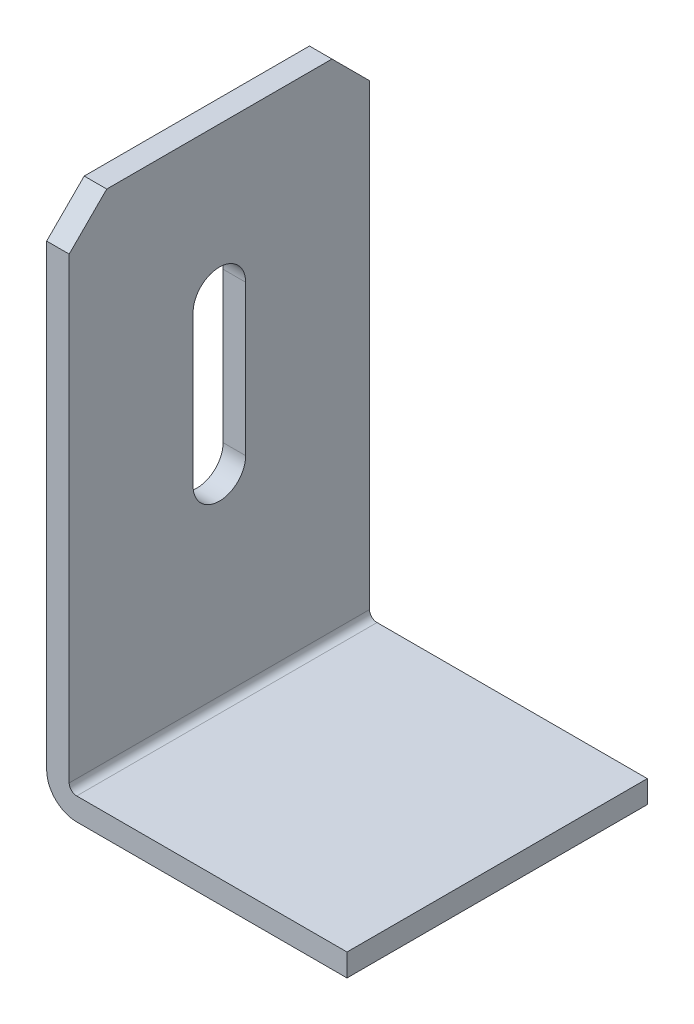
ISO-10303-21;
HEADER;
FILE_DESCRIPTION(('STEP AP214'),'2;1');
FILE_NAME('part.step','',(''),(''),'','','');
FILE_SCHEMA(('AUTOMOTIVE_DESIGN { 1 0 10303 214 1 1 1 1 }'));
ENDSEC;
DATA;
#1=APPLICATION_CONTEXT('core data for automotive mechanical design processes');
#2=APPLICATION_PROTOCOL_DEFINITION('international standard','automotive_design',2000,#1);
#3=PRODUCT_CONTEXT('',#1,'mechanical');
#4=PRODUCT('Part','Part','',(#3));
#5=PRODUCT_RELATED_PRODUCT_CATEGORY('part','',(#4));
#6=PRODUCT_DEFINITION_FORMATION('','',#4);
#7=PRODUCT_DEFINITION_CONTEXT('part definition',#1,'design');
#8=PRODUCT_DEFINITION('design','',#6,#7);
#9=PRODUCT_DEFINITION_SHAPE('','',#8);
#10=(LENGTH_UNIT() NAMED_UNIT(*) SI_UNIT(.MILLI.,.METRE.));
#11=(NAMED_UNIT(*) PLANE_ANGLE_UNIT() SI_UNIT($,.RADIAN.));
#12=(NAMED_UNIT(*) SI_UNIT($,.STERADIAN.) SOLID_ANGLE_UNIT());
#13=UNCERTAINTY_MEASURE_WITH_UNIT(LENGTH_MEASURE(1.E-05),#10,'distance_accuracy_value','');
#14=(GEOMETRIC_REPRESENTATION_CONTEXT(3) GLOBAL_UNCERTAINTY_ASSIGNED_CONTEXT((#13)) GLOBAL_UNIT_ASSIGNED_CONTEXT((#10,
#11,#12)) REPRESENTATION_CONTEXT('',''));
#15=CARTESIAN_POINT('',(0.,0.,0.));
#16=DIRECTION('',(0.,0.,1.));
#17=DIRECTION('',(1.,0.,0.));
#18=AXIS2_PLACEMENT_3D('',#15,#16,#17);
#19=CARTESIAN_POINT('',(0.,0.,40.));
#20=DIRECTION('',(0.,1.,0.));
#21=DIRECTION('',(0.,0.,1.));
#22=AXIS2_PLACEMENT_3D('',#19,#20,#21);
#23=PLANE('',#22);
#24=DIRECTION('',(0.,0.,-1.));
#25=VECTOR('',#24,1.);
#26=CARTESIAN_POINT('',(40.,0.,40.));
#27=LINE('',#26,#25);
#28=CARTESIAN_POINT('',(40.,0.,40.));
#29=VERTEX_POINT('',#28);
#30=CARTESIAN_POINT('',(40.,0.,0.));
#31=VERTEX_POINT('',#30);
#32=EDGE_CURVE('E92',#29,#31,#27,.T.);
#33=ORIENTED_EDGE('',*,*,#32,.F.);
#34=DIRECTION('',(1.,0.,0.));
#35=VECTOR('',#34,1.);
#36=CARTESIAN_POINT('',(4.,0.,40.));
#37=LINE('',#36,#35);
#38=CARTESIAN_POINT('',(4.,0.,40.));
#39=VERTEX_POINT('',#38);
#40=EDGE_CURVE('E71',#39,#29,#37,.T.);
#41=ORIENTED_EDGE('',*,*,#40,.F.);
#42=DIRECTION('',(0.,0.,-1.));
#43=VECTOR('',#42,1.);
#44=CARTESIAN_POINT('',(4.,0.,40.));
#45=LINE('',#44,#43);
#46=CARTESIAN_POINT('',(4.,0.,0.));
#47=VERTEX_POINT('',#46);
#48=EDGE_CURVE('E64',#47,#39,#45,.F.);
#49=ORIENTED_EDGE('',*,*,#48,.F.);
#50=DIRECTION('',(-1.,0.,0.));
#51=VECTOR('',#50,1.);
#52=CARTESIAN_POINT('',(3.,0.,0.));
#53=LINE('',#52,#51);
#54=EDGE_CURVE('E68',#31,#47,#53,.T.);
#55=ORIENTED_EDGE('',*,*,#54,.F.);
#56=EDGE_LOOP('',(#33,#41,#49,#55));
#57=FACE_BOUND('',#56,.T.);
#58=ADVANCED_FACE('F16',(#57),#23,.F.);
#59=CARTESIAN_POINT('',(4.,4.,40.));
#60=DIRECTION('',(0.,0.,-1.));
#61=DIRECTION('',(-1.,0.,0.));
#62=AXIS2_PLACEMENT_3D('',#59,#60,#61);
#63=CYLINDRICAL_SURFACE('',#62,4.);
#64=CARTESIAN_POINT('',(4.,4.,40.));
#65=DIRECTION('',(0.,0.,-1.));
#66=DIRECTION('',(-1.,0.,0.));
#67=AXIS2_PLACEMENT_3D('',#64,#65,#66);
#68=CIRCLE('',#67,4.);
#69=CARTESIAN_POINT('',(0.,4.,40.));
#70=VERTEX_POINT('',#69);
#71=EDGE_CURVE('E130',#70,#39,#68,.F.);
#72=ORIENTED_EDGE('',*,*,#71,.F.);
#73=DIRECTION('',(0.,0.,-1.));
#74=VECTOR('',#73,1.);
#75=CARTESIAN_POINT('',(0.,4.,40.));
#76=LINE('',#75,#74);
#77=CARTESIAN_POINT('',(0.,4.,0.));
#78=VERTEX_POINT('',#77);
#79=EDGE_CURVE('E90',#70,#78,#76,.T.);
#80=ORIENTED_EDGE('',*,*,#79,.T.);
#81=CARTESIAN_POINT('',(4.,4.,0.));
#82=DIRECTION('',(0.,0.,-1.));
#83=DIRECTION('',(-1.,0.,0.));
#84=AXIS2_PLACEMENT_3D('',#81,#82,#83);
#85=CIRCLE('',#84,4.);
#86=EDGE_CURVE('E19',#47,#78,#85,.T.);
#87=ORIENTED_EDGE('',*,*,#86,.F.);
#88=ORIENTED_EDGE('',*,*,#48,.T.);
#89=EDGE_LOOP('',(#72,#80,#87,#88));
#90=FACE_BOUND('',#89,.T.);
#91=ADVANCED_FACE('F88',(#90),#63,.T.);
#92=CARTESIAN_POINT('',(40.,3.,40.));
#93=DIRECTION('',(1.,0.,0.));
#94=DIRECTION('',(0.,0.,-1.));
#95=AXIS2_PLACEMENT_3D('',#92,#93,#94);
#96=PLANE('',#95);
#97=DIRECTION('',(0.,1.,0.));
#98=VECTOR('',#97,1.);
#99=CARTESIAN_POINT('',(40.,3.,40.));
#100=LINE('',#99,#98);
#101=CARTESIAN_POINT('',(40.,3.,40.));
#102=VERTEX_POINT('',#101);
#103=EDGE_CURVE('E94',#102,#29,#100,.F.);
#104=ORIENTED_EDGE('',*,*,#103,.T.);
#105=ORIENTED_EDGE('',*,*,#32,.T.);
#106=DIRECTION('',(0.,1.,0.));
#107=VECTOR('',#106,1.);
#108=CARTESIAN_POINT('',(40.,3.,0.));
#109=LINE('',#108,#107);
#110=CARTESIAN_POINT('',(40.,3.,0.));
#111=VERTEX_POINT('',#110);
#112=EDGE_CURVE('E84',#31,#111,#109,.T.);
#113=ORIENTED_EDGE('',*,*,#112,.T.);
#114=DIRECTION('',(0.,0.,1.));
#115=VECTOR('',#114,1.);
#116=CARTESIAN_POINT('',(40.,3.,40.));
#117=LINE('',#116,#115);
#118=EDGE_CURVE('E127',#102,#111,#117,.F.);
#119=ORIENTED_EDGE('',*,*,#118,.F.);
#120=EDGE_LOOP('',(#104,#105,#113,#119));
#121=FACE_BOUND('',#120,.T.);
#122=ADVANCED_FACE('F388',(#121),#96,.T.);
#123=CARTESIAN_POINT('',(0.,0.,40.));
#124=DIRECTION('',(1.,0.,0.));
#125=DIRECTION('',(0.,0.,-1.));
#126=AXIS2_PLACEMENT_3D('',#123,#124,#125);
#127=PLANE('',#126);
#128=DIRECTION('',(0.,0.707106781186546,0.707106781186549));
#129=VECTOR('',#128,1.);
#130=CARTESIAN_POINT('',(0.,65.,0.));
#131=LINE('',#130,#129);
#132=CARTESIAN_POINT('',(0.,65.,0.));
#133=VERTEX_POINT('',#132);
#134=CARTESIAN_POINT('',(0.,70.,5.));
#135=VERTEX_POINT('',#134);
#136=EDGE_CURVE('E175',#133,#135,#131,.T.);
#137=ORIENTED_EDGE('',*,*,#136,.F.);
#138=DIRECTION('',(0.,1.,0.));
#139=VECTOR('',#138,1.);
#140=CARTESIAN_POINT('',(0.,4.,0.));
#141=LINE('',#140,#139);
#142=EDGE_CURVE('E178',#133,#78,#141,.F.);
#143=ORIENTED_EDGE('',*,*,#142,.T.);
#144=ORIENTED_EDGE('',*,*,#79,.F.);
#145=DIRECTION('',(0.,1.,0.));
#146=VECTOR('',#145,1.);
#147=CARTESIAN_POINT('',(0.,3.,40.));
#148=LINE('',#147,#146);
#149=CARTESIAN_POINT('',(0.,65.,40.));
#150=VERTEX_POINT('',#149);
#151=EDGE_CURVE('E140',#150,#70,#148,.F.);
#152=ORIENTED_EDGE('',*,*,#151,.F.);
#153=DIRECTION('',(0.,0.707106781186549,-0.707106781186546));
#154=VECTOR('',#153,1.);
#155=CARTESIAN_POINT('',(0.,70.,35.));
#156=LINE('',#155,#154);
#157=CARTESIAN_POINT('',(0.,70.,35.));
#158=VERTEX_POINT('',#157);
#159=EDGE_CURVE('E141',#150,#158,#156,.T.);
#160=ORIENTED_EDGE('',*,*,#159,.T.);
#161=DIRECTION('',(0.,0.,1.));
#162=VECTOR('',#161,1.);
#163=CARTESIAN_POINT('',(0.,70.,40.));
#164=LINE('',#163,#162);
#165=EDGE_CURVE('E157',#135,#158,#164,.T.);
#166=ORIENTED_EDGE('',*,*,#165,.F.);
#167=EDGE_LOOP('',(#137,#143,#144,#152,#160,#166));
#168=FACE_BOUND('',#167,.T.);
#169=CARTESIAN_POINT('',(0.,50.,20.));
#170=DIRECTION('',(1.,0.,0.));
#171=DIRECTION('',(0.,0.,-1.));
#172=AXIS2_PLACEMENT_3D('',#169,#170,#171);
#173=CIRCLE('',#172,3.5);
#174=CARTESIAN_POINT('',(0.,50.,16.5));
#175=VERTEX_POINT('',#174);
#176=CARTESIAN_POINT('',(0.,50.,23.5));
#177=VERTEX_POINT('',#176);
#178=EDGE_CURVE('E123',#175,#177,#173,.T.);
#179=ORIENTED_EDGE('',*,*,#178,.T.);
#180=DIRECTION('',(0.,-1.,0.));
#181=VECTOR('',#180,1.);
#182=CARTESIAN_POINT('',(0.,50.,23.5));
#183=LINE('',#182,#181);
#184=CARTESIAN_POINT('',(0.,30.,23.5));
#185=VERTEX_POINT('',#184);
#186=EDGE_CURVE('E187',#177,#185,#183,.T.);
#187=ORIENTED_EDGE('',*,*,#186,.T.);
#188=CARTESIAN_POINT('',(0.,30.,20.));
#189=DIRECTION('',(1.,0.,0.));
#190=DIRECTION('',(0.,0.,-1.));
#191=AXIS2_PLACEMENT_3D('',#188,#189,#190);
#192=CIRCLE('',#191,3.49999999999999);
#193=CARTESIAN_POINT('',(0.,30.,16.5));
#194=VERTEX_POINT('',#193);
#195=EDGE_CURVE('E118',#185,#194,#192,.T.);
#196=ORIENTED_EDGE('',*,*,#195,.T.);
#197=DIRECTION('',(0.,1.,0.));
#198=VECTOR('',#197,1.);
#199=CARTESIAN_POINT('',(0.,50.,16.5));
#200=LINE('',#199,#198);
#201=EDGE_CURVE('E199',#194,#175,#200,.T.);
#202=ORIENTED_EDGE('',*,*,#201,.T.);
#203=EDGE_LOOP('',(#179,#187,#196,#202));
#204=FACE_BOUND('',#203,.T.);
#205=ADVANCED_FACE('F262',(#168,#204),#127,.F.);
#206=CARTESIAN_POINT('',(0.,3.,40.));
#207=DIRECTION('',(0.,1.,0.));
#208=DIRECTION('',(0.,0.,1.));
#209=AXIS2_PLACEMENT_3D('',#206,#207,#208);
#210=PLANE('',#209);
#211=DIRECTION('',(1.,0.,0.));
#212=VECTOR('',#211,1.);
#213=CARTESIAN_POINT('',(0.,3.,40.));
#214=LINE('',#213,#212);
#215=CARTESIAN_POINT('',(4.,3.,40.));
#216=VERTEX_POINT('',#215);
#217=EDGE_CURVE('E202',#216,#102,#214,.T.);
#218=ORIENTED_EDGE('',*,*,#217,.T.);
#219=ORIENTED_EDGE('',*,*,#118,.T.);
#220=DIRECTION('',(1.,0.,0.));
#221=VECTOR('',#220,1.);
#222=CARTESIAN_POINT('',(0.,3.,0.));
#223=LINE('',#222,#221);
#224=CARTESIAN_POINT('',(4.,3.,0.));
#225=VERTEX_POINT('',#224);
#226=EDGE_CURVE('E129',#111,#225,#223,.F.);
#227=ORIENTED_EDGE('',*,*,#226,.T.);
#228=DIRECTION('',(0.,0.,-1.));
#229=VECTOR('',#228,1.);
#230=CARTESIAN_POINT('',(4.,3.,40.));
#231=LINE('',#230,#229);
#232=EDGE_CURVE('E117',#225,#216,#231,.F.);
#233=ORIENTED_EDGE('',*,*,#232,.T.);
#234=EDGE_LOOP('',(#218,#219,#227,#233));
#235=FACE_BOUND('',#234,.T.);
#236=ADVANCED_FACE('F213',(#235),#210,.T.);
#237=CARTESIAN_POINT('',(-0.00100000000000013,50.,20.));
#238=DIRECTION('',(1.,0.,0.));
#239=DIRECTION('',(0.,0.,-1.));
#240=AXIS2_PLACEMENT_3D('',#237,#238,#239);
#241=CYLINDRICAL_SURFACE('',#240,3.5);
#242=DIRECTION('',(1.,0.,0.));
#243=VECTOR('',#242,1.);
#244=CARTESIAN_POINT('',(-0.00100000000000013,50.,16.5));
#245=LINE('',#244,#243);
#246=CARTESIAN_POINT('',(3.,50.,16.5));
#247=VERTEX_POINT('',#246);
#248=EDGE_CURVE('E126',#175,#247,#245,.T.);
#249=ORIENTED_EDGE('',*,*,#248,.T.);
#250=CARTESIAN_POINT('',(3.,50.,20.));
#251=DIRECTION('',(1.,0.,0.));
#252=DIRECTION('',(0.,0.,-1.));
#253=AXIS2_PLACEMENT_3D('',#250,#251,#252);
#254=CIRCLE('',#253,3.5);
#255=CARTESIAN_POINT('',(3.,50.,23.5));
#256=VERTEX_POINT('',#255);
#257=EDGE_CURVE('E114',#256,#247,#254,.F.);
#258=ORIENTED_EDGE('',*,*,#257,.F.);
#259=DIRECTION('',(1.,0.,0.));
#260=VECTOR('',#259,1.);
#261=CARTESIAN_POINT('',(-0.00100000000000013,50.,23.5));
#262=LINE('',#261,#260);
#263=EDGE_CURVE('E198',#256,#177,#262,.F.);
#264=ORIENTED_EDGE('',*,*,#263,.T.);
#265=ORIENTED_EDGE('',*,*,#178,.F.);
#266=EDGE_LOOP('',(#249,#258,#264,#265));
#267=FACE_BOUND('',#266,.T.);
#268=ADVANCED_FACE('F268',(#267),#241,.F.);
#269=CARTESIAN_POINT('',(-0.00100000000000013,50.,16.5));
#270=DIRECTION('',(0.,0.,-1.));
#271=DIRECTION('',(0.,1.,0.));
#272=AXIS2_PLACEMENT_3D('',#269,#270,#271);
#273=PLANE('',#272);
#274=DIRECTION('',(1.,0.,0.));
#275=VECTOR('',#274,1.);
#276=CARTESIAN_POINT('',(-0.00100000000000013,30.,16.5));
#277=LINE('',#276,#275);
#278=CARTESIAN_POINT('',(3.,30.,16.5));
#279=VERTEX_POINT('',#278);
#280=EDGE_CURVE('E122',#194,#279,#277,.T.);
#281=ORIENTED_EDGE('',*,*,#280,.T.);
#282=DIRECTION('',(0.,1.,0.));
#283=VECTOR('',#282,1.);
#284=CARTESIAN_POINT('',(3.,0.,16.5));
#285=LINE('',#284,#283);
#286=EDGE_CURVE('E113',#247,#279,#285,.F.);
#287=ORIENTED_EDGE('',*,*,#286,.F.);
#288=ORIENTED_EDGE('',*,*,#248,.F.);
#289=ORIENTED_EDGE('',*,*,#201,.F.);
#290=EDGE_LOOP('',(#281,#287,#288,#289));
#291=FACE_BOUND('',#290,.T.);
#292=ADVANCED_FACE('F362',(#291),#273,.F.);
#293=CARTESIAN_POINT('',(-0.00100000000000013,30.,20.));
#294=DIRECTION('',(1.,0.,0.));
#295=DIRECTION('',(0.,0.,-1.));
#296=AXIS2_PLACEMENT_3D('',#293,#294,#295);
#297=CYLINDRICAL_SURFACE('',#296,3.49999999999999);
#298=DIRECTION('',(1.,0.,0.));
#299=VECTOR('',#298,1.);
#300=CARTESIAN_POINT('',(-0.00100000000000013,30.,23.5));
#301=LINE('',#300,#299);
#302=CARTESIAN_POINT('',(3.,30.,23.5));
#303=VERTEX_POINT('',#302);
#304=EDGE_CURVE('E121',#185,#303,#301,.T.);
#305=ORIENTED_EDGE('',*,*,#304,.T.);
#306=CARTESIAN_POINT('',(3.,30.,20.));
#307=DIRECTION('',(1.,0.,0.));
#308=DIRECTION('',(0.,0.,-1.));
#309=AXIS2_PLACEMENT_3D('',#306,#307,#308);
#310=CIRCLE('',#309,3.49999999999999);
#311=EDGE_CURVE('E109',#279,#303,#310,.F.);
#312=ORIENTED_EDGE('',*,*,#311,.F.);
#313=ORIENTED_EDGE('',*,*,#280,.F.);
#314=ORIENTED_EDGE('',*,*,#195,.F.);
#315=EDGE_LOOP('',(#305,#312,#313,#314));
#316=FACE_BOUND('',#315,.T.);
#317=ADVANCED_FACE('F355',(#316),#297,.F.);
#318=CARTESIAN_POINT('',(-0.00100000000000013,50.,23.5));
#319=DIRECTION('',(0.,0.,1.));
#320=DIRECTION('',(0.,-1.,0.));
#321=AXIS2_PLACEMENT_3D('',#318,#319,#320);
#322=PLANE('',#321);
#323=ORIENTED_EDGE('',*,*,#263,.F.);
#324=DIRECTION('',(0.,1.,0.));
#325=VECTOR('',#324,1.);
#326=CARTESIAN_POINT('',(3.,0.,23.5));
#327=LINE('',#326,#325);
#328=EDGE_CURVE('E112',#303,#256,#327,.T.);
#329=ORIENTED_EDGE('',*,*,#328,.F.);
#330=ORIENTED_EDGE('',*,*,#304,.F.);
#331=ORIENTED_EDGE('',*,*,#186,.F.);
#332=EDGE_LOOP('',(#323,#329,#330,#331));
#333=FACE_BOUND('',#332,.T.);
#334=ADVANCED_FACE('F273',(#333),#322,.F.);
#335=CARTESIAN_POINT('',(4.,4.,0.));
#336=DIRECTION('',(0.,0.,1.));
#337=DIRECTION('',(1.,0.,0.));
#338=AXIS2_PLACEMENT_3D('',#335,#336,#337);
#339=PLANE('',#338);
#340=DIRECTION('',(1.,0.,0.));
#341=VECTOR('',#340,1.);
#342=CARTESIAN_POINT('',(4.,65.,0.));
#343=LINE('',#342,#341);
#344=CARTESIAN_POINT('',(3.,65.,0.));
#345=VERTEX_POINT('',#344);
#346=EDGE_CURVE('E172',#345,#133,#343,.F.);
#347=ORIENTED_EDGE('',*,*,#346,.F.);
#348=DIRECTION('',(0.,1.,0.));
#349=VECTOR('',#348,1.);
#350=CARTESIAN_POINT('',(3.,0.,0.));
#351=LINE('',#350,#349);
#352=CARTESIAN_POINT('',(3.,4.,0.));
#353=VERTEX_POINT('',#352);
#354=EDGE_CURVE('E183',#353,#345,#351,.T.);
#355=ORIENTED_EDGE('',*,*,#354,.F.);
#356=CARTESIAN_POINT('',(4.,4.,0.));
#357=DIRECTION('',(0.,0.,-1.));
#358=DIRECTION('',(-1.,0.,0.));
#359=AXIS2_PLACEMENT_3D('',#356,#357,#358);
#360=CIRCLE('',#359,1.);
#361=EDGE_CURVE('E91',#353,#225,#360,.F.);
#362=ORIENTED_EDGE('',*,*,#361,.T.);
#363=ORIENTED_EDGE('',*,*,#226,.F.);
#364=ORIENTED_EDGE('',*,*,#112,.F.);
#365=ORIENTED_EDGE('',*,*,#54,.T.);
#366=ORIENTED_EDGE('',*,*,#86,.T.);
#367=ORIENTED_EDGE('',*,*,#142,.F.);
#368=EDGE_LOOP('',(#347,#355,#362,#363,#364,#365,#366,#367));
#369=FACE_BOUND('',#368,.T.);
#370=ADVANCED_FACE('F79',(#369),#339,.F.);
#371=CARTESIAN_POINT('',(4.,65.,0.));
#372=DIRECTION('',(0.,0.707106781186549,-0.707106781186546));
#373=DIRECTION('',(0.,0.707106781186546,0.707106781186549));
#374=AXIS2_PLACEMENT_3D('',#371,#372,#373);
#375=PLANE('',#374);
#376=DIRECTION('',(0.,0.707106781186546,0.707106781186548));
#377=VECTOR('',#376,1.);
#378=CARTESIAN_POINT('',(3.,65.,0.));
#379=LINE('',#378,#377);
#380=CARTESIAN_POINT('',(3.,70.,5.));
#381=VERTEX_POINT('',#380);
#382=EDGE_CURVE('E167',#345,#381,#379,.T.);
#383=ORIENTED_EDGE('',*,*,#382,.F.);
#384=ORIENTED_EDGE('',*,*,#346,.T.);
#385=ORIENTED_EDGE('',*,*,#136,.T.);
#386=DIRECTION('',(1.,0.,0.));
#387=VECTOR('',#386,1.);
#388=CARTESIAN_POINT('',(0.,70.,5.));
#389=LINE('',#388,#387);
#390=EDGE_CURVE('E162',#381,#135,#389,.F.);
#391=ORIENTED_EDGE('',*,*,#390,.F.);
#392=EDGE_LOOP('',(#383,#384,#385,#391));
#393=FACE_BOUND('',#392,.T.);
#394=ADVANCED_FACE('F298',(#393),#375,.T.);
#395=CARTESIAN_POINT('',(0.,70.,40.));
#396=DIRECTION('',(0.,1.,0.));
#397=DIRECTION('',(0.,0.,1.));
#398=AXIS2_PLACEMENT_3D('',#395,#396,#397);
#399=PLANE('',#398);
#400=ORIENTED_EDGE('',*,*,#165,.T.);
#401=DIRECTION('',(1.,0.,0.));
#402=VECTOR('',#401,1.);
#403=CARTESIAN_POINT('',(0.,70.,35.));
#404=LINE('',#403,#402);
#405=CARTESIAN_POINT('',(3.,70.,35.));
#406=VERTEX_POINT('',#405);
#407=EDGE_CURVE('E146',#158,#406,#404,.T.);
#408=ORIENTED_EDGE('',*,*,#407,.T.);
#409=DIRECTION('',(0.,0.,-1.));
#410=VECTOR('',#409,1.);
#411=CARTESIAN_POINT('',(3.,70.,40.));
#412=LINE('',#411,#410);
#413=EDGE_CURVE('E152',#381,#406,#412,.F.);
#414=ORIENTED_EDGE('',*,*,#413,.F.);
#415=ORIENTED_EDGE('',*,*,#390,.T.);
#416=EDGE_LOOP('',(#400,#408,#414,#415));
#417=FACE_BOUND('',#416,.T.);
#418=ADVANCED_FACE('F301',(#417),#399,.T.);
#419=CARTESIAN_POINT('',(0.,70.,35.));
#420=DIRECTION('',(0.,-0.707106781186546,-0.707106781186549));
#421=DIRECTION('',(0.,0.707106781186549,-0.707106781186546));
#422=AXIS2_PLACEMENT_3D('',#419,#420,#421);
#423=PLANE('',#422);
#424=DIRECTION('',(1.,0.,0.));
#425=VECTOR('',#424,1.);
#426=CARTESIAN_POINT('',(4.,65.,40.));
#427=LINE('',#426,#425);
#428=CARTESIAN_POINT('',(3.,65.,40.));
#429=VERTEX_POINT('',#428);
#430=EDGE_CURVE('E137',#429,#150,#427,.F.);
#431=ORIENTED_EDGE('',*,*,#430,.F.);
#432=DIRECTION('',(0.,-0.707106781186549,0.707106781186545));
#433=VECTOR('',#432,1.);
#434=CARTESIAN_POINT('',(3.,70.,35.));
#435=LINE('',#434,#433);
#436=EDGE_CURVE('E149',#406,#429,#435,.T.);
#437=ORIENTED_EDGE('',*,*,#436,.F.);
#438=ORIENTED_EDGE('',*,*,#407,.F.);
#439=ORIENTED_EDGE('',*,*,#159,.F.);
#440=EDGE_LOOP('',(#431,#437,#438,#439));
#441=FACE_BOUND('',#440,.T.);
#442=ADVANCED_FACE('F292',(#441),#423,.F.);
#443=CARTESIAN_POINT('',(4.,3.,40.));
#444=DIRECTION('',(0.,0.,1.));
#445=DIRECTION('',(1.,0.,0.));
#446=AXIS2_PLACEMENT_3D('',#443,#444,#445);
#447=PLANE('',#446);
#448=ORIENTED_EDGE('',*,*,#151,.T.);
#449=ORIENTED_EDGE('',*,*,#71,.T.);
#450=ORIENTED_EDGE('',*,*,#40,.T.);
#451=ORIENTED_EDGE('',*,*,#103,.F.);
#452=ORIENTED_EDGE('',*,*,#217,.F.);
#453=CARTESIAN_POINT('',(4.,4.,40.));
#454=DIRECTION('',(0.,0.,-1.));
#455=DIRECTION('',(-1.,0.,0.));
#456=AXIS2_PLACEMENT_3D('',#453,#454,#455);
#457=CIRCLE('',#456,1.);
#458=CARTESIAN_POINT('',(3.,4.,40.));
#459=VERTEX_POINT('',#458);
#460=EDGE_CURVE('E34',#216,#459,#457,.T.);
#461=ORIENTED_EDGE('',*,*,#460,.T.);
#462=DIRECTION('',(0.,1.,0.));
#463=VECTOR('',#462,1.);
#464=CARTESIAN_POINT('',(3.,0.,40.));
#465=LINE('',#464,#463);
#466=EDGE_CURVE('E25',#429,#459,#465,.F.);
#467=ORIENTED_EDGE('',*,*,#466,.F.);
#468=ORIENTED_EDGE('',*,*,#430,.T.);
#469=EDGE_LOOP('',(#448,#449,#450,#451,#452,#461,#467,#468));
#470=FACE_BOUND('',#469,.T.);
#471=ADVANCED_FACE('F289',(#470),#447,.T.);
#472=CARTESIAN_POINT('',(4.,4.,40.));
#473=DIRECTION('',(0.,0.,-1.));
#474=DIRECTION('',(-1.,0.,0.));
#475=AXIS2_PLACEMENT_3D('',#472,#473,#474);
#476=CYLINDRICAL_SURFACE('',#475,1.);
#477=DIRECTION('',(0.,0.,-1.));
#478=VECTOR('',#477,1.);
#479=CARTESIAN_POINT('',(3.,4.,40.));
#480=LINE('',#479,#478);
#481=EDGE_CURVE('E11',#459,#353,#480,.T.);
#482=ORIENTED_EDGE('',*,*,#481,.F.);
#483=ORIENTED_EDGE('',*,*,#460,.F.);
#484=ORIENTED_EDGE('',*,*,#232,.F.);
#485=ORIENTED_EDGE('',*,*,#361,.F.);
#486=EDGE_LOOP('',(#482,#483,#484,#485));
#487=FACE_BOUND('',#486,.T.);
#488=ADVANCED_FACE('F218',(#487),#476,.F.);
#489=CARTESIAN_POINT('',(3.,0.,40.));
#490=DIRECTION('',(1.,0.,0.));
#491=DIRECTION('',(0.,0.,-1.));
#492=AXIS2_PLACEMENT_3D('',#489,#490,#491);
#493=PLANE('',#492);
#494=ORIENTED_EDGE('',*,*,#466,.T.);
#495=ORIENTED_EDGE('',*,*,#481,.T.);
#496=ORIENTED_EDGE('',*,*,#354,.T.);
#497=ORIENTED_EDGE('',*,*,#382,.T.);
#498=ORIENTED_EDGE('',*,*,#413,.T.);
#499=ORIENTED_EDGE('',*,*,#436,.T.);
#500=EDGE_LOOP('',(#494,#495,#496,#497,#498,#499));
#501=FACE_BOUND('',#500,.T.);
#502=ORIENTED_EDGE('',*,*,#311,.T.);
#503=ORIENTED_EDGE('',*,*,#328,.T.);
#504=ORIENTED_EDGE('',*,*,#257,.T.);
#505=ORIENTED_EDGE('',*,*,#286,.T.);
#506=EDGE_LOOP('',(#502,#503,#504,#505));
#507=FACE_BOUND('',#506,.T.);
#508=ADVANCED_FACE('F286',(#501,#507),#493,.T.);
#509=CLOSED_SHELL('',(#58,#91,#122,#205,#236,#268,#292,#317,#334,#370,#394,#418,#442,#471,#488,#508));
#510=MANIFOLD_SOLID_BREP('B1',#509);
#511=ADVANCED_BREP_SHAPE_REPRESENTATION('',(#18,#510),#14);
#512=SHAPE_DEFINITION_REPRESENTATION(#9,#511);
ENDSEC;
END-ISO-10303-21;
